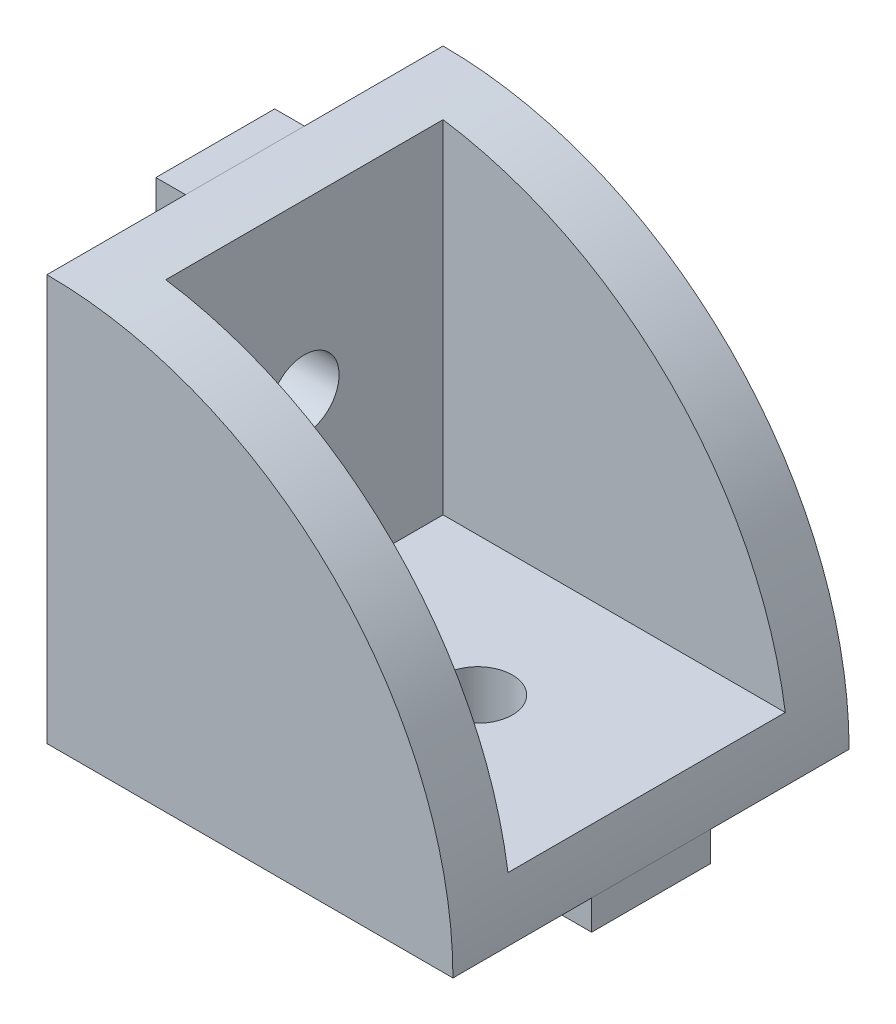
ISO-10303-21;
HEADER;
FILE_DESCRIPTION(('STEP AP214'),'2;1');
FILE_NAME('part.step','',(''),(''),'','','');
FILE_SCHEMA(('AUTOMOTIVE_DESIGN { 1 0 10303 214 1 1 1 1 }'));
ENDSEC;
DATA;
#1=APPLICATION_CONTEXT('core data for automotive mechanical design processes');
#2=APPLICATION_PROTOCOL_DEFINITION('international standard','automotive_design',2000,#1);
#3=PRODUCT_CONTEXT('',#1,'mechanical');
#4=PRODUCT('Part','Part','',(#3));
#5=PRODUCT_RELATED_PRODUCT_CATEGORY('part','',(#4));
#6=PRODUCT_DEFINITION_FORMATION('','',#4);
#7=PRODUCT_DEFINITION_CONTEXT('part definition',#1,'design');
#8=PRODUCT_DEFINITION('design','',#6,#7);
#9=PRODUCT_DEFINITION_SHAPE('','',#8);
#10=(LENGTH_UNIT() NAMED_UNIT(*) SI_UNIT(.MILLI.,.METRE.));
#11=(NAMED_UNIT(*) PLANE_ANGLE_UNIT() SI_UNIT($,.RADIAN.));
#12=(NAMED_UNIT(*) SI_UNIT($,.STERADIAN.) SOLID_ANGLE_UNIT());
#13=UNCERTAINTY_MEASURE_WITH_UNIT(LENGTH_MEASURE(1.E-05),#10,'distance_accuracy_value','');
#14=(GEOMETRIC_REPRESENTATION_CONTEXT(3) GLOBAL_UNCERTAINTY_ASSIGNED_CONTEXT((#13)) GLOBAL_UNIT_ASSIGNED_CONTEXT((#10,
#11,#12)) REPRESENTATION_CONTEXT('',''));
#15=CARTESIAN_POINT('',(0.,0.,0.));
#16=DIRECTION('',(0.,0.,1.));
#17=DIRECTION('',(1.,0.,0.));
#18=AXIS2_PLACEMENT_3D('',#15,#16,#17);
#19=CARTESIAN_POINT('',(0.,20.5,20.));
#20=DIRECTION('',(1.,0.,0.));
#21=DIRECTION('',(0.,1.,0.));
#22=AXIS2_PLACEMENT_3D('',#19,#20,#21);
#23=PLANE('',#22);
#24=DIRECTION('',(0.,1.,0.));
#25=VECTOR('',#24,1.);
#26=CARTESIAN_POINT('',(0.,20.5,13.));
#27=LINE('',#26,#25);
#28=CARTESIAN_POINT('',(0.,3.,13.));
#29=VERTEX_POINT('',#28);
#30=CARTESIAN_POINT('',(0.,20.5,13.));
#31=VERTEX_POINT('',#30);
#32=EDGE_CURVE('E47',#29,#31,#27,.T.);
#33=ORIENTED_EDGE('',*,*,#32,.F.);
#34=DIRECTION('',(0.,0.,1.));
#35=VECTOR('',#34,1.);
#36=CARTESIAN_POINT('',(0.,3.,13.));
#37=LINE('',#36,#35);
#38=CARTESIAN_POINT('',(0.,3.,7.));
#39=VERTEX_POINT('',#38);
#40=EDGE_CURVE('E152',#39,#29,#37,.T.);
#41=ORIENTED_EDGE('',*,*,#40,.F.);
#42=DIRECTION('',(0.,-1.,0.));
#43=VECTOR('',#42,1.);
#44=CARTESIAN_POINT('',(0.,20.5,7.));
#45=LINE('',#44,#43);
#46=CARTESIAN_POINT('',(0.,20.5,7.));
#47=VERTEX_POINT('',#46);
#48=EDGE_CURVE('E53',#47,#39,#45,.T.);
#49=ORIENTED_EDGE('',*,*,#48,.F.);
#50=DIRECTION('',(0.,0.,-1.));
#51=VECTOR('',#50,1.);
#52=CARTESIAN_POINT('',(0.,20.5,20.));
#53=LINE('',#52,#51);
#54=CARTESIAN_POINT('',(0.,20.5,0.));
#55=VERTEX_POINT('',#54);
#56=EDGE_CURVE('E231',#47,#55,#53,.T.);
#57=ORIENTED_EDGE('',*,*,#56,.T.);
#58=DIRECTION('',(0.,-1.,0.));
#59=VECTOR('',#58,1.);
#60=CARTESIAN_POINT('',(0.,20.5,0.));
#61=LINE('',#60,#59);
#62=CARTESIAN_POINT('',(0.,0.,0.));
#63=VERTEX_POINT('',#62);
#64=EDGE_CURVE('E221',#55,#63,#61,.T.);
#65=ORIENTED_EDGE('',*,*,#64,.T.);
#66=DIRECTION('',(0.,0.,-1.));
#67=VECTOR('',#66,1.);
#68=CARTESIAN_POINT('',(0.,0.,20.));
#69=LINE('',#68,#67);
#70=CARTESIAN_POINT('',(0.,0.,20.));
#71=VERTEX_POINT('',#70);
#72=EDGE_CURVE('E228',#71,#63,#69,.T.);
#73=ORIENTED_EDGE('',*,*,#72,.F.);
#74=DIRECTION('',(0.,-1.,0.));
#75=VECTOR('',#74,1.);
#76=CARTESIAN_POINT('',(0.,20.5,20.));
#77=LINE('',#76,#75);
#78=CARTESIAN_POINT('',(0.,20.5,20.));
#79=VERTEX_POINT('',#78);
#80=EDGE_CURVE('E213',#79,#71,#77,.T.);
#81=ORIENTED_EDGE('',*,*,#80,.F.);
#82=EDGE_CURVE('E232',#79,#31,#53,.T.);
#83=ORIENTED_EDGE('',*,*,#82,.T.);
#84=EDGE_LOOP('',(#33,#41,#49,#57,#65,#73,#81,#83));
#85=FACE_BOUND('',#84,.T.);
#86=ADVANCED_FACE('F32',(#85),#23,.F.);
#87=CARTESIAN_POINT('',(0.,0.,20.));
#88=DIRECTION('',(0.,1.,0.));
#89=DIRECTION('',(0.,0.,1.));
#90=AXIS2_PLACEMENT_3D('',#87,#88,#89);
#91=PLANE('',#90);
#92=DIRECTION('',(-1.,0.,0.));
#93=VECTOR('',#92,1.);
#94=CARTESIAN_POINT('',(20.5,0.,13.));
#95=LINE('',#94,#93);
#96=CARTESIAN_POINT('',(20.5,0.,13.));
#97=VERTEX_POINT('',#96);
#98=CARTESIAN_POINT('',(3.,0.,13.));
#99=VERTEX_POINT('',#98);
#100=EDGE_CURVE('E177',#97,#99,#95,.T.);
#101=ORIENTED_EDGE('',*,*,#100,.F.);
#102=DIRECTION('',(0.,0.,-1.));
#103=VECTOR('',#102,1.);
#104=CARTESIAN_POINT('',(20.5,0.,20.));
#105=LINE('',#104,#103);
#106=CARTESIAN_POINT('',(20.5,0.,20.));
#107=VERTEX_POINT('',#106);
#108=EDGE_CURVE('E225',#107,#97,#105,.T.);
#109=ORIENTED_EDGE('',*,*,#108,.F.);
#110=DIRECTION('',(1.,0.,0.));
#111=VECTOR('',#110,1.);
#112=CARTESIAN_POINT('',(0.,0.,20.));
#113=LINE('',#112,#111);
#114=EDGE_CURVE('E216',#71,#107,#113,.T.);
#115=ORIENTED_EDGE('',*,*,#114,.F.);
#116=ORIENTED_EDGE('',*,*,#72,.T.);
#117=DIRECTION('',(1.,0.,0.));
#118=VECTOR('',#117,1.);
#119=CARTESIAN_POINT('',(0.,0.,0.));
#120=LINE('',#119,#118);
#121=CARTESIAN_POINT('',(20.5,0.,0.));
#122=VERTEX_POINT('',#121);
#123=EDGE_CURVE('E214',#63,#122,#120,.T.);
#124=ORIENTED_EDGE('',*,*,#123,.T.);
#125=CARTESIAN_POINT('',(20.5,0.,7.));
#126=VERTEX_POINT('',#125);
#127=EDGE_CURVE('E218',#126,#122,#105,.T.);
#128=ORIENTED_EDGE('',*,*,#127,.F.);
#129=DIRECTION('',(-1.,0.,0.));
#130=VECTOR('',#129,1.);
#131=CARTESIAN_POINT('',(20.5,0.,7.));
#132=LINE('',#131,#130);
#133=CARTESIAN_POINT('',(3.,0.,7.));
#134=VERTEX_POINT('',#133);
#135=EDGE_CURVE('E188',#126,#134,#132,.T.);
#136=ORIENTED_EDGE('',*,*,#135,.T.);
#137=DIRECTION('',(0.,0.,1.));
#138=VECTOR('',#137,1.);
#139=CARTESIAN_POINT('',(3.,0.,13.));
#140=LINE('',#139,#138);
#141=EDGE_CURVE('E171',#134,#99,#140,.T.);
#142=ORIENTED_EDGE('',*,*,#141,.T.);
#143=EDGE_LOOP('',(#101,#109,#115,#116,#124,#128,#136,#142));
#144=FACE_BOUND('',#143,.T.);
#145=ADVANCED_FACE('F270',(#144),#91,.F.);
#146=CARTESIAN_POINT('',(0.,0.,20.));
#147=DIRECTION('',(0.,0.,-1.));
#148=DIRECTION('',(-1.,0.,0.));
#149=AXIS2_PLACEMENT_3D('',#146,#147,#148);
#150=CYLINDRICAL_SURFACE('',#149,20.5);
#151=CARTESIAN_POINT('',(0.,0.,0.));
#152=DIRECTION('',(0.,0.,1.));
#153=DIRECTION('',(1.,0.,0.));
#154=AXIS2_PLACEMENT_3D('',#151,#152,#153);
#155=CIRCLE('',#154,20.5);
#156=EDGE_CURVE('E209',#122,#55,#155,.T.);
#157=ORIENTED_EDGE('',*,*,#156,.T.);
#158=ORIENTED_EDGE('',*,*,#56,.F.);
#159=DIRECTION('',(0.,0.,-1.));
#160=VECTOR('',#159,1.);
#161=CARTESIAN_POINT('',(0.,20.5,13.));
#162=LINE('',#161,#160);
#163=EDGE_CURVE('E287',#31,#47,#162,.T.);
#164=ORIENTED_EDGE('',*,*,#163,.F.);
#165=ORIENTED_EDGE('',*,*,#82,.F.);
#166=CARTESIAN_POINT('',(0.,0.,20.));
#167=DIRECTION('',(0.,0.,1.));
#168=DIRECTION('',(1.,0.,0.));
#169=AXIS2_PLACEMENT_3D('',#166,#167,#168);
#170=CIRCLE('',#169,20.5);
#171=EDGE_CURVE('E210',#107,#79,#170,.T.);
#172=ORIENTED_EDGE('',*,*,#171,.F.);
#173=ORIENTED_EDGE('',*,*,#108,.T.);
#174=DIRECTION('',(0.,0.,1.));
#175=VECTOR('',#174,1.);
#176=CARTESIAN_POINT('',(20.5,0.,13.));
#177=LINE('',#176,#175);
#178=EDGE_CURVE('E175',#126,#97,#177,.T.);
#179=ORIENTED_EDGE('',*,*,#178,.F.);
#180=ORIENTED_EDGE('',*,*,#127,.T.);
#181=EDGE_LOOP('',(#157,#158,#164,#165,#172,#173,#179,#180));
#182=FACE_BOUND('',#181,.T.);
#183=CARTESIAN_POINT('',(0.,0.,17.));
#184=DIRECTION('',(0.,0.,-1.));
#185=DIRECTION('',(-1.,0.,0.));
#186=AXIS2_PLACEMENT_3D('',#183,#184,#185);
#187=CIRCLE('',#186,20.5);
#188=CARTESIAN_POINT('',(3.,20.2792997906732,17.));
#189=VERTEX_POINT('',#188);
#190=CARTESIAN_POINT('',(20.2792997906732,3.,17.));
#191=VERTEX_POINT('',#190);
#192=EDGE_CURVE('E11',#189,#191,#187,.T.);
#193=ORIENTED_EDGE('',*,*,#192,.F.);
#194=DIRECTION('',(0.,0.,-1.));
#195=VECTOR('',#194,1.);
#196=CARTESIAN_POINT('',(3.,20.2792997906732,20.));
#197=LINE('',#196,#195);
#198=CARTESIAN_POINT('',(3.,20.2792997906732,3.));
#199=VERTEX_POINT('',#198);
#200=EDGE_CURVE('E234',#189,#199,#197,.T.);
#201=ORIENTED_EDGE('',*,*,#200,.T.);
#202=CARTESIAN_POINT('',(0.,0.,3.));
#203=DIRECTION('',(0.,0.,1.));
#204=DIRECTION('',(1.,0.,0.));
#205=AXIS2_PLACEMENT_3D('',#202,#203,#204);
#206=CIRCLE('',#205,20.5);
#207=CARTESIAN_POINT('',(20.2792997906732,3.,3.));
#208=VERTEX_POINT('',#207);
#209=EDGE_CURVE('E237',#208,#199,#206,.T.);
#210=ORIENTED_EDGE('',*,*,#209,.F.);
#211=DIRECTION('',(0.,0.,-1.));
#212=VECTOR('',#211,1.);
#213=CARTESIAN_POINT('',(20.2792997906732,3.,20.));
#214=LINE('',#213,#212);
#215=EDGE_CURVE('E40',#191,#208,#214,.T.);
#216=ORIENTED_EDGE('',*,*,#215,.F.);
#217=EDGE_LOOP('',(#193,#201,#210,#216));
#218=FACE_BOUND('',#217,.T.);
#219=ADVANCED_FACE('F34',(#182,#218),#150,.T.);
#220=CARTESIAN_POINT('',(0.,0.,20.));
#221=DIRECTION('',(0.,0.,1.));
#222=DIRECTION('',(1.,0.,0.));
#223=AXIS2_PLACEMENT_3D('',#220,#221,#222);
#224=PLANE('',#223);
#225=ORIENTED_EDGE('',*,*,#171,.T.);
#226=ORIENTED_EDGE('',*,*,#80,.T.);
#227=ORIENTED_EDGE('',*,*,#114,.T.);
#228=EDGE_LOOP('',(#225,#226,#227));
#229=FACE_BOUND('',#228,.T.);
#230=ADVANCED_FACE('F265',(#229),#224,.T.);
#231=CARTESIAN_POINT('',(0.,0.,0.));
#232=DIRECTION('',(0.,0.,1.));
#233=DIRECTION('',(1.,0.,0.));
#234=AXIS2_PLACEMENT_3D('',#231,#232,#233);
#235=PLANE('',#234);
#236=ORIENTED_EDGE('',*,*,#156,.F.);
#237=ORIENTED_EDGE('',*,*,#123,.F.);
#238=ORIENTED_EDGE('',*,*,#64,.F.);
#239=EDGE_LOOP('',(#236,#237,#238));
#240=FACE_BOUND('',#239,.T.);
#241=ADVANCED_FACE('F257',(#240),#235,.F.);
#242=CARTESIAN_POINT('',(20.5,3.,17.));
#243=DIRECTION('',(0.,0.,-1.));
#244=DIRECTION('',(-1.,0.,0.));
#245=AXIS2_PLACEMENT_3D('',#242,#243,#244);
#246=PLANE('',#245);
#247=ORIENTED_EDGE('',*,*,#192,.T.);
#248=DIRECTION('',(-1.,0.,0.));
#249=VECTOR('',#248,1.);
#250=CARTESIAN_POINT('',(20.5,3.,17.));
#251=LINE('',#250,#249);
#252=CARTESIAN_POINT('',(3.,3.,17.));
#253=VERTEX_POINT('',#252);
#254=EDGE_CURVE('E207',#191,#253,#251,.T.);
#255=ORIENTED_EDGE('',*,*,#254,.T.);
#256=DIRECTION('',(0.,-1.,0.));
#257=VECTOR('',#256,1.);
#258=CARTESIAN_POINT('',(3.,3.,17.));
#259=LINE('',#258,#257);
#260=EDGE_CURVE('E197',#189,#253,#259,.T.);
#261=ORIENTED_EDGE('',*,*,#260,.F.);
#262=EDGE_LOOP('',(#247,#255,#261));
#263=FACE_BOUND('',#262,.T.);
#264=ADVANCED_FACE('F255',(#263),#246,.T.);
#265=CARTESIAN_POINT('',(20.5,3.,17.));
#266=DIRECTION('',(0.,1.,0.));
#267=DIRECTION('',(0.,0.,1.));
#268=AXIS2_PLACEMENT_3D('',#265,#266,#267);
#269=PLANE('',#268);
#270=CARTESIAN_POINT('',(11.75,3.,10.));
#271=DIRECTION('',(0.,1.,0.));
#272=DIRECTION('',(0.,0.,1.));
#273=AXIS2_PLACEMENT_3D('',#270,#271,#272);
#274=CIRCLE('',#273,1.75);
#275=CARTESIAN_POINT('',(11.75,3.,11.75));
#276=VERTEX_POINT('',#275);
#277=EDGE_CURVE('E158',#276,#276,#274,.T.);
#278=ORIENTED_EDGE('',*,*,#277,.F.);
#279=EDGE_LOOP('',(#278));
#280=FACE_BOUND('',#279,.T.);
#281=ORIENTED_EDGE('',*,*,#215,.T.);
#282=DIRECTION('',(-1.,0.,0.));
#283=VECTOR('',#282,1.);
#284=CARTESIAN_POINT('',(20.5,3.,3.));
#285=LINE('',#284,#283);
#286=CARTESIAN_POINT('',(3.,3.,3.));
#287=VERTEX_POINT('',#286);
#288=EDGE_CURVE('E205',#208,#287,#285,.T.);
#289=ORIENTED_EDGE('',*,*,#288,.T.);
#290=DIRECTION('',(0.,0.,-1.));
#291=VECTOR('',#290,1.);
#292=CARTESIAN_POINT('',(3.,3.,17.));
#293=LINE('',#292,#291);
#294=EDGE_CURVE('E200',#253,#287,#293,.T.);
#295=ORIENTED_EDGE('',*,*,#294,.F.);
#296=ORIENTED_EDGE('',*,*,#254,.F.);
#297=EDGE_LOOP('',(#281,#289,#295,#296));
#298=FACE_BOUND('',#297,.T.);
#299=ADVANCED_FACE('F243',(#280,#298),#269,.T.);
#300=CARTESIAN_POINT('',(20.5,3.,3.));
#301=DIRECTION('',(0.,0.,1.));
#302=DIRECTION('',(1.,0.,0.));
#303=AXIS2_PLACEMENT_3D('',#300,#301,#302);
#304=PLANE('',#303);
#305=ORIENTED_EDGE('',*,*,#209,.T.);
#306=DIRECTION('',(0.,1.,0.));
#307=VECTOR('',#306,1.);
#308=CARTESIAN_POINT('',(3.,3.,3.));
#309=LINE('',#308,#307);
#310=EDGE_CURVE('E203',#287,#199,#309,.T.);
#311=ORIENTED_EDGE('',*,*,#310,.F.);
#312=ORIENTED_EDGE('',*,*,#288,.F.);
#313=EDGE_LOOP('',(#305,#311,#312));
#314=FACE_BOUND('',#313,.T.);
#315=ADVANCED_FACE('F250',(#314),#304,.T.);
#316=CARTESIAN_POINT('',(3.,0.,0.));
#317=DIRECTION('',(-1.,0.,0.));
#318=DIRECTION('',(0.,0.,1.));
#319=AXIS2_PLACEMENT_3D('',#316,#317,#318);
#320=PLANE('',#319);
#321=CARTESIAN_POINT('',(3.,11.75,10.));
#322=DIRECTION('',(-1.,0.,0.));
#323=DIRECTION('',(0.,0.,1.));
#324=AXIS2_PLACEMENT_3D('',#321,#322,#323);
#325=CIRCLE('',#324,1.75);
#326=CARTESIAN_POINT('',(3.,11.75,11.75));
#327=VERTEX_POINT('',#326);
#328=EDGE_CURVE('E318',#327,#327,#325,.T.);
#329=ORIENTED_EDGE('',*,*,#328,.T.);
#330=EDGE_LOOP('',(#329));
#331=FACE_BOUND('',#330,.T.);
#332=ORIENTED_EDGE('',*,*,#260,.T.);
#333=ORIENTED_EDGE('',*,*,#294,.T.);
#334=ORIENTED_EDGE('',*,*,#310,.T.);
#335=ORIENTED_EDGE('',*,*,#200,.F.);
#336=EDGE_LOOP('',(#332,#333,#334,#335));
#337=FACE_BOUND('',#336,.T.);
#338=ADVANCED_FACE('F253',(#331,#337),#320,.F.);
#339=CARTESIAN_POINT('',(20.5,0.,13.));
#340=DIRECTION('',(0.,0.,-1.));
#341=DIRECTION('',(0.,1.,0.));
#342=AXIS2_PLACEMENT_3D('',#339,#340,#341);
#343=PLANE('',#342);
#344=DIRECTION('',(0.,-1.,0.));
#345=VECTOR('',#344,1.);
#346=CARTESIAN_POINT('',(3.,0.,13.));
#347=LINE('',#346,#345);
#348=CARTESIAN_POINT('',(3.,-1.5,13.));
#349=VERTEX_POINT('',#348);
#350=EDGE_CURVE('E166',#99,#349,#347,.T.);
#351=ORIENTED_EDGE('',*,*,#350,.T.);
#352=DIRECTION('',(-1.,0.,0.));
#353=VECTOR('',#352,1.);
#354=CARTESIAN_POINT('',(20.5,-1.5,13.));
#355=LINE('',#354,#353);
#356=CARTESIAN_POINT('',(20.5,-1.5,13.));
#357=VERTEX_POINT('',#356);
#358=EDGE_CURVE('E194',#357,#349,#355,.T.);
#359=ORIENTED_EDGE('',*,*,#358,.F.);
#360=DIRECTION('',(0.,-1.,0.));
#361=VECTOR('',#360,1.);
#362=CARTESIAN_POINT('',(20.5,0.,13.));
#363=LINE('',#362,#361);
#364=EDGE_CURVE('E167',#97,#357,#363,.T.);
#365=ORIENTED_EDGE('',*,*,#364,.F.);
#366=ORIENTED_EDGE('',*,*,#100,.T.);
#367=EDGE_LOOP('',(#351,#359,#365,#366));
#368=FACE_BOUND('',#367,.T.);
#369=ADVANCED_FACE('F300',(#368),#343,.F.);
#370=CARTESIAN_POINT('',(20.5,-1.5,13.));
#371=DIRECTION('',(0.,1.,0.));
#372=DIRECTION('',(0.,0.,1.));
#373=AXIS2_PLACEMENT_3D('',#370,#371,#372);
#374=PLANE('',#373);
#375=CARTESIAN_POINT('',(11.75,-1.5,10.));
#376=DIRECTION('',(0.,-1.,0.));
#377=DIRECTION('',(0.,0.,-1.));
#378=AXIS2_PLACEMENT_3D('',#375,#376,#377);
#379=CIRCLE('',#378,1.75);
#380=CARTESIAN_POINT('',(11.75,-1.5,8.25));
#381=VERTEX_POINT('',#380);
#382=EDGE_CURVE('E155',#381,#381,#379,.T.);
#383=ORIENTED_EDGE('',*,*,#382,.F.);
#384=EDGE_LOOP('',(#383));
#385=FACE_BOUND('',#384,.T.);
#386=DIRECTION('',(0.,0.,-1.));
#387=VECTOR('',#386,1.);
#388=CARTESIAN_POINT('',(3.,-1.5,13.));
#389=LINE('',#388,#387);
#390=CARTESIAN_POINT('',(3.,-1.5,7.));
#391=VERTEX_POINT('',#390);
#392=EDGE_CURVE('E180',#349,#391,#389,.T.);
#393=ORIENTED_EDGE('',*,*,#392,.T.);
#394=DIRECTION('',(-1.,0.,0.));
#395=VECTOR('',#394,1.);
#396=CARTESIAN_POINT('',(20.5,-1.5,7.));
#397=LINE('',#396,#395);
#398=CARTESIAN_POINT('',(20.5,-1.5,7.));
#399=VERTEX_POINT('',#398);
#400=EDGE_CURVE('E191',#399,#391,#397,.T.);
#401=ORIENTED_EDGE('',*,*,#400,.F.);
#402=DIRECTION('',(0.,0.,-1.));
#403=VECTOR('',#402,1.);
#404=CARTESIAN_POINT('',(20.5,-1.5,13.));
#405=LINE('',#404,#403);
#406=EDGE_CURVE('E170',#357,#399,#405,.T.);
#407=ORIENTED_EDGE('',*,*,#406,.F.);
#408=ORIENTED_EDGE('',*,*,#358,.T.);
#409=EDGE_LOOP('',(#393,#401,#407,#408));
#410=FACE_BOUND('',#409,.T.);
#411=ADVANCED_FACE('F303',(#385,#410),#374,.F.);
#412=CARTESIAN_POINT('',(20.5,0.,7.));
#413=DIRECTION('',(0.,0.,1.));
#414=DIRECTION('',(0.,-1.,0.));
#415=AXIS2_PLACEMENT_3D('',#412,#413,#414);
#416=PLANE('',#415);
#417=DIRECTION('',(0.,1.,0.));
#418=VECTOR('',#417,1.);
#419=CARTESIAN_POINT('',(3.,0.,7.));
#420=LINE('',#419,#418);
#421=EDGE_CURVE('E182',#391,#134,#420,.T.);
#422=ORIENTED_EDGE('',*,*,#421,.T.);
#423=ORIENTED_EDGE('',*,*,#135,.F.);
#424=DIRECTION('',(0.,1.,0.));
#425=VECTOR('',#424,1.);
#426=CARTESIAN_POINT('',(20.5,0.,7.));
#427=LINE('',#426,#425);
#428=EDGE_CURVE('E173',#399,#126,#427,.T.);
#429=ORIENTED_EDGE('',*,*,#428,.F.);
#430=ORIENTED_EDGE('',*,*,#400,.T.);
#431=EDGE_LOOP('',(#422,#423,#429,#430));
#432=FACE_BOUND('',#431,.T.);
#433=ADVANCED_FACE('F307',(#432),#416,.F.);
#434=CARTESIAN_POINT('',(20.5,0.,0.));
#435=DIRECTION('',(1.,0.,0.));
#436=DIRECTION('',(0.,0.,-1.));
#437=AXIS2_PLACEMENT_3D('',#434,#435,#436);
#438=PLANE('',#437);
#439=ORIENTED_EDGE('',*,*,#364,.T.);
#440=ORIENTED_EDGE('',*,*,#406,.T.);
#441=ORIENTED_EDGE('',*,*,#428,.T.);
#442=ORIENTED_EDGE('',*,*,#178,.T.);
#443=EDGE_LOOP('',(#439,#440,#441,#442));
#444=FACE_BOUND('',#443,.T.);
#445=ADVANCED_FACE('F295',(#444),#438,.T.);
#446=CARTESIAN_POINT('',(3.,0.,0.));
#447=DIRECTION('',(1.,0.,0.));
#448=DIRECTION('',(0.,0.,-1.));
#449=AXIS2_PLACEMENT_3D('',#446,#447,#448);
#450=PLANE('',#449);
#451=ORIENTED_EDGE('',*,*,#350,.F.);
#452=ORIENTED_EDGE('',*,*,#141,.F.);
#453=ORIENTED_EDGE('',*,*,#421,.F.);
#454=ORIENTED_EDGE('',*,*,#392,.F.);
#455=EDGE_LOOP('',(#451,#452,#453,#454));
#456=FACE_BOUND('',#455,.T.);
#457=ADVANCED_FACE('F343',(#456),#450,.F.);
#458=CARTESIAN_POINT('',(11.75,3.5,10.));
#459=DIRECTION('',(0.,-1.,0.));
#460=DIRECTION('',(0.,0.,-1.));
#461=AXIS2_PLACEMENT_3D('',#458,#459,#460);
#462=CYLINDRICAL_SURFACE('',#461,1.75);
#463=ORIENTED_EDGE('',*,*,#277,.T.);
#464=EDGE_LOOP('',(#463));
#465=FACE_BOUND('',#464,.T.);
#466=ORIENTED_EDGE('',*,*,#382,.T.);
#467=EDGE_LOOP('',(#466));
#468=FACE_BOUND('',#467,.T.);
#469=ADVANCED_FACE('F340',(#465,#468),#462,.F.);
#470=CARTESIAN_POINT('',(-1.5,20.5,13.));
#471=DIRECTION('',(0.,0.,-1.));
#472=DIRECTION('',(0.,1.,0.));
#473=AXIS2_PLACEMENT_3D('',#470,#471,#472);
#474=PLANE('',#473);
#475=ORIENTED_EDGE('',*,*,#32,.T.);
#476=DIRECTION('',(1.,0.,0.));
#477=VECTOR('',#476,1.);
#478=CARTESIAN_POINT('',(-1.5,20.5,13.));
#479=LINE('',#478,#477);
#480=CARTESIAN_POINT('',(-1.5,20.5,13.));
#481=VERTEX_POINT('',#480);
#482=EDGE_CURVE('E137',#481,#31,#479,.T.);
#483=ORIENTED_EDGE('',*,*,#482,.F.);
#484=DIRECTION('',(0.,1.,0.));
#485=VECTOR('',#484,1.);
#486=CARTESIAN_POINT('',(-1.5,20.5,13.));
#487=LINE('',#486,#485);
#488=CARTESIAN_POINT('',(-1.5,3.,13.));
#489=VERTEX_POINT('',#488);
#490=EDGE_CURVE('E143',#489,#481,#487,.T.);
#491=ORIENTED_EDGE('',*,*,#490,.F.);
#492=DIRECTION('',(1.,0.,0.));
#493=VECTOR('',#492,1.);
#494=CARTESIAN_POINT('',(-1.5,3.,13.));
#495=LINE('',#494,#493);
#496=EDGE_CURVE('E315',#489,#29,#495,.T.);
#497=ORIENTED_EDGE('',*,*,#496,.T.);
#498=EDGE_LOOP('',(#475,#483,#491,#497));
#499=FACE_BOUND('',#498,.T.);
#500=ADVANCED_FACE('F154',(#499),#474,.F.);
#501=CARTESIAN_POINT('',(-1.5,20.5,13.));
#502=DIRECTION('',(0.,-1.,0.));
#503=DIRECTION('',(1.,0.,0.));
#504=AXIS2_PLACEMENT_3D('',#501,#502,#503);
#505=PLANE('',#504);
#506=ORIENTED_EDGE('',*,*,#163,.T.);
#507=DIRECTION('',(1.,0.,0.));
#508=VECTOR('',#507,1.);
#509=CARTESIAN_POINT('',(-1.5,20.5,7.));
#510=LINE('',#509,#508);
#511=CARTESIAN_POINT('',(-1.5,20.5,7.));
#512=VERTEX_POINT('',#511);
#513=EDGE_CURVE('E139',#512,#47,#510,.T.);
#514=ORIENTED_EDGE('',*,*,#513,.F.);
#515=DIRECTION('',(0.,0.,-1.));
#516=VECTOR('',#515,1.);
#517=CARTESIAN_POINT('',(-1.5,20.5,13.));
#518=LINE('',#517,#516);
#519=EDGE_CURVE('E132',#481,#512,#518,.T.);
#520=ORIENTED_EDGE('',*,*,#519,.F.);
#521=ORIENTED_EDGE('',*,*,#482,.T.);
#522=EDGE_LOOP('',(#506,#514,#520,#521));
#523=FACE_BOUND('',#522,.T.);
#524=ADVANCED_FACE('F135',(#523),#505,.F.);
#525=CARTESIAN_POINT('',(-1.5,20.5,7.));
#526=DIRECTION('',(0.,0.,1.));
#527=DIRECTION('',(0.,-1.,0.));
#528=AXIS2_PLACEMENT_3D('',#525,#526,#527);
#529=PLANE('',#528);
#530=ORIENTED_EDGE('',*,*,#48,.T.);
#531=DIRECTION('',(1.,0.,0.));
#532=VECTOR('',#531,1.);
#533=CARTESIAN_POINT('',(-1.5,3.,7.));
#534=LINE('',#533,#532);
#535=CARTESIAN_POINT('',(-1.5,3.,7.));
#536=VERTEX_POINT('',#535);
#537=EDGE_CURVE('E160',#536,#39,#534,.T.);
#538=ORIENTED_EDGE('',*,*,#537,.F.);
#539=DIRECTION('',(0.,-1.,0.));
#540=VECTOR('',#539,1.);
#541=CARTESIAN_POINT('',(-1.5,20.5,7.));
#542=LINE('',#541,#540);
#543=EDGE_CURVE('E142',#512,#536,#542,.T.);
#544=ORIENTED_EDGE('',*,*,#543,.F.);
#545=ORIENTED_EDGE('',*,*,#513,.T.);
#546=EDGE_LOOP('',(#530,#538,#544,#545));
#547=FACE_BOUND('',#546,.T.);
#548=ADVANCED_FACE('F311',(#547),#529,.F.);
#549=CARTESIAN_POINT('',(-1.5,3.,13.));
#550=DIRECTION('',(0.,1.,0.));
#551=DIRECTION('',(-1.,0.,0.));
#552=AXIS2_PLACEMENT_3D('',#549,#550,#551);
#553=PLANE('',#552);
#554=ORIENTED_EDGE('',*,*,#40,.T.);
#555=ORIENTED_EDGE('',*,*,#496,.F.);
#556=DIRECTION('',(0.,0.,1.));
#557=VECTOR('',#556,1.);
#558=CARTESIAN_POINT('',(-1.5,3.,13.));
#559=LINE('',#558,#557);
#560=EDGE_CURVE('E148',#536,#489,#559,.T.);
#561=ORIENTED_EDGE('',*,*,#560,.F.);
#562=ORIENTED_EDGE('',*,*,#537,.T.);
#563=EDGE_LOOP('',(#554,#555,#561,#562));
#564=FACE_BOUND('',#563,.T.);
#565=ADVANCED_FACE('F323',(#564),#553,.F.);
#566=CARTESIAN_POINT('',(-1.5,0.,0.));
#567=DIRECTION('',(1.,0.,0.));
#568=DIRECTION('',(0.,1.,0.));
#569=AXIS2_PLACEMENT_3D('',#566,#567,#568);
#570=PLANE('',#569);
#571=CARTESIAN_POINT('',(-1.5,11.75,10.));
#572=DIRECTION('',(-1.,0.,0.));
#573=DIRECTION('',(0.,-1.,0.));
#574=AXIS2_PLACEMENT_3D('',#571,#572,#573);
#575=CIRCLE('',#574,1.75);
#576=CARTESIAN_POINT('',(-1.5,10.,10.));
#577=VERTEX_POINT('',#576);
#578=EDGE_CURVE('E432',#577,#577,#575,.T.);
#579=ORIENTED_EDGE('',*,*,#578,.F.);
#580=EDGE_LOOP('',(#579));
#581=FACE_BOUND('',#580,.T.);
#582=ORIENTED_EDGE('',*,*,#490,.T.);
#583=ORIENTED_EDGE('',*,*,#519,.T.);
#584=ORIENTED_EDGE('',*,*,#543,.T.);
#585=ORIENTED_EDGE('',*,*,#560,.T.);
#586=EDGE_LOOP('',(#582,#583,#584,#585));
#587=FACE_BOUND('',#586,.T.);
#588=ADVANCED_FACE('F146',(#581,#587),#570,.F.);
#589=CARTESIAN_POINT('',(3.5,11.75,10.));
#590=DIRECTION('',(-1.,0.,0.));
#591=DIRECTION('',(0.,-1.,0.));
#592=AXIS2_PLACEMENT_3D('',#589,#590,#591);
#593=CYLINDRICAL_SURFACE('',#592,1.75);
#594=ORIENTED_EDGE('',*,*,#578,.T.);
#595=EDGE_LOOP('',(#594));
#596=FACE_BOUND('',#595,.T.);
#597=ORIENTED_EDGE('',*,*,#328,.F.);
#598=EDGE_LOOP('',(#597));
#599=FACE_BOUND('',#598,.T.);
#600=ADVANCED_FACE('F330',(#596,#599),#593,.F.);
#601=CLOSED_SHELL('',(#86,#145,#219,#230,#241,#264,#299,#315,#338,#369,#411,#433,#445,#457,#469,
#500,#524,#548,#565,#588,#600));
#602=MANIFOLD_SOLID_BREP('B2',#601);
#603=ADVANCED_BREP_SHAPE_REPRESENTATION('',(#18,#602),#14);
#604=SHAPE_DEFINITION_REPRESENTATION(#9,#603);
ENDSEC;
END-ISO-10303-21;
